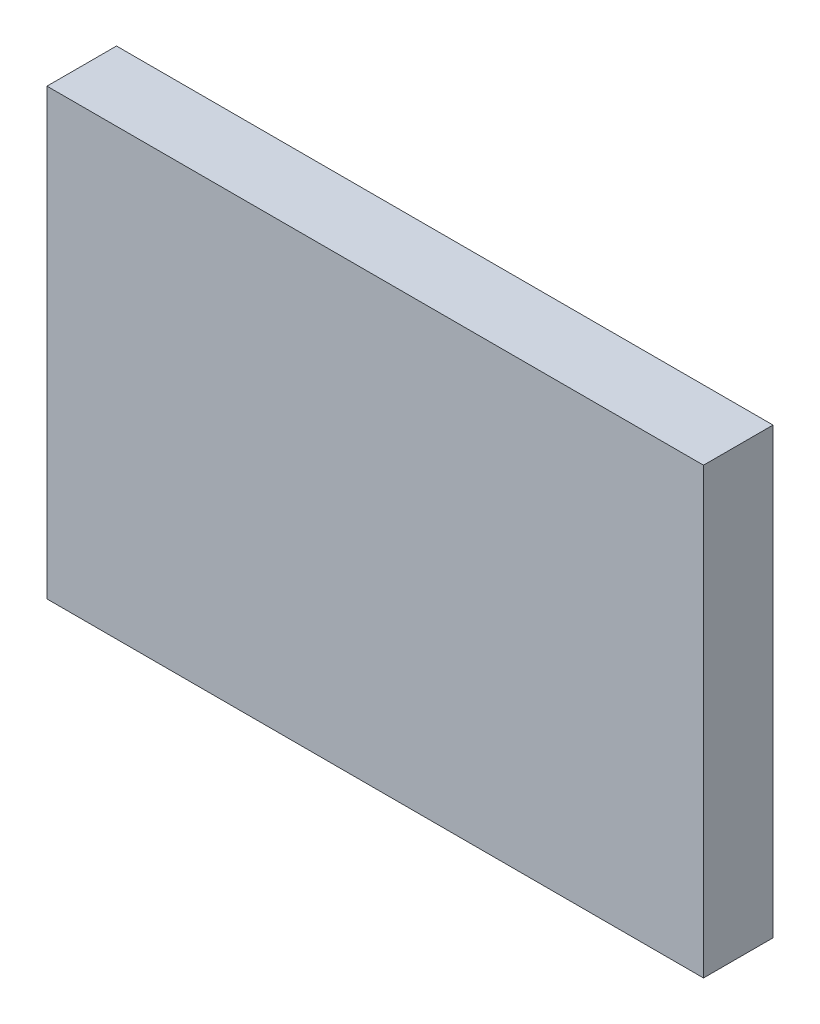
ISO-10303-21;
HEADER;
FILE_DESCRIPTION(('STEP AP214'),'2;1');
FILE_NAME('part.step','',(''),(''),'','','');
FILE_SCHEMA(('AUTOMOTIVE_DESIGN { 1 0 10303 214 1 1 1 1 }'));
ENDSEC;
DATA;
#1=APPLICATION_CONTEXT('core data for automotive mechanical design processes');
#2=APPLICATION_PROTOCOL_DEFINITION('international standard','automotive_design',2000,#1);
#3=PRODUCT_CONTEXT('',#1,'mechanical');
#4=PRODUCT('Part','Part','',(#3));
#5=PRODUCT_RELATED_PRODUCT_CATEGORY('part','',(#4));
#6=PRODUCT_DEFINITION_FORMATION('','',#4);
#7=PRODUCT_DEFINITION_CONTEXT('part definition',#1,'design');
#8=PRODUCT_DEFINITION('design','',#6,#7);
#9=PRODUCT_DEFINITION_SHAPE('','',#8);
#10=(LENGTH_UNIT() NAMED_UNIT(*) SI_UNIT(.MILLI.,.METRE.));
#11=(NAMED_UNIT(*) PLANE_ANGLE_UNIT() SI_UNIT($,.RADIAN.));
#12=(NAMED_UNIT(*) SI_UNIT($,.STERADIAN.) SOLID_ANGLE_UNIT());
#13=UNCERTAINTY_MEASURE_WITH_UNIT(LENGTH_MEASURE(1.E-05),#10,'distance_accuracy_value','');
#14=(GEOMETRIC_REPRESENTATION_CONTEXT(3) GLOBAL_UNCERTAINTY_ASSIGNED_CONTEXT((#13)) GLOBAL_UNIT_ASSIGNED_CONTEXT((#10,
#11,#12)) REPRESENTATION_CONTEXT('',''));
#15=CARTESIAN_POINT('',(0.,0.,0.));
#16=DIRECTION('',(0.,0.,1.));
#17=DIRECTION('',(1.,0.,0.));
#18=AXIS2_PLACEMENT_3D('',#15,#16,#17);
#19=CARTESIAN_POINT('',(85.,-57.5,18.));
#20=DIRECTION('',(-1.,0.,0.));
#21=DIRECTION('',(0.,0.,1.));
#22=AXIS2_PLACEMENT_3D('',#19,#20,#21);
#23=PLANE('',#22);
#24=DIRECTION('',(0.,1.,0.));
#25=VECTOR('',#24,1.);
#26=CARTESIAN_POINT('',(85.,-57.5,0.));
#27=LINE('',#26,#25);
#28=CARTESIAN_POINT('',(85.,-57.5,0.));
#29=VERTEX_POINT('',#28);
#30=CARTESIAN_POINT('',(85.,57.5,0.));
#31=VERTEX_POINT('',#30);
#32=EDGE_CURVE('E97',#29,#31,#27,.T.);
#33=ORIENTED_EDGE('',*,*,#32,.T.);
#34=DIRECTION('',(0.,0.,-1.));
#35=VECTOR('',#34,1.);
#36=CARTESIAN_POINT('',(85.,57.5,18.));
#37=LINE('',#36,#35);
#38=CARTESIAN_POINT('',(85.,57.5,18.));
#39=VERTEX_POINT('',#38);
#40=EDGE_CURVE('E11',#39,#31,#37,.T.);
#41=ORIENTED_EDGE('',*,*,#40,.F.);
#42=DIRECTION('',(0.,1.,0.));
#43=VECTOR('',#42,1.);
#44=CARTESIAN_POINT('',(85.,-57.5,18.));
#45=LINE('',#44,#43);
#46=CARTESIAN_POINT('',(85.,-57.5,18.));
#47=VERTEX_POINT('',#46);
#48=EDGE_CURVE('E85',#47,#39,#45,.T.);
#49=ORIENTED_EDGE('',*,*,#48,.F.);
#50=DIRECTION('',(0.,0.,-1.));
#51=VECTOR('',#50,1.);
#52=CARTESIAN_POINT('',(85.,-57.5,18.));
#53=LINE('',#52,#51);
#54=EDGE_CURVE('E93',#47,#29,#53,.T.);
#55=ORIENTED_EDGE('',*,*,#54,.T.);
#56=EDGE_LOOP('',(#33,#41,#49,#55));
#57=FACE_BOUND('',#56,.T.);
#58=ADVANCED_FACE('F34',(#57),#23,.F.);
#59=CARTESIAN_POINT('',(-85.,57.5,18.));
#60=DIRECTION('',(0.,-1.,0.));
#61=DIRECTION('',(0.,0.,-1.));
#62=AXIS2_PLACEMENT_3D('',#59,#60,#61);
#63=PLANE('',#62);
#64=DIRECTION('',(-1.,0.,0.));
#65=VECTOR('',#64,1.);
#66=CARTESIAN_POINT('',(-85.,57.5,0.));
#67=LINE('',#66,#65);
#68=CARTESIAN_POINT('',(-85.,57.5,0.));
#69=VERTEX_POINT('',#68);
#70=EDGE_CURVE('E89',#31,#69,#67,.T.);
#71=ORIENTED_EDGE('',*,*,#70,.T.);
#72=DIRECTION('',(0.,0.,-1.));
#73=VECTOR('',#72,1.);
#74=CARTESIAN_POINT('',(-85.,57.5,18.));
#75=LINE('',#74,#73);
#76=CARTESIAN_POINT('',(-85.,57.5,18.));
#77=VERTEX_POINT('',#76);
#78=EDGE_CURVE('E42',#77,#69,#75,.T.);
#79=ORIENTED_EDGE('',*,*,#78,.F.);
#80=DIRECTION('',(-1.,0.,0.));
#81=VECTOR('',#80,1.);
#82=CARTESIAN_POINT('',(-85.,57.5,18.));
#83=LINE('',#82,#81);
#84=EDGE_CURVE('E80',#39,#77,#83,.T.);
#85=ORIENTED_EDGE('',*,*,#84,.F.);
#86=ORIENTED_EDGE('',*,*,#40,.T.);
#87=EDGE_LOOP('',(#71,#79,#85,#86));
#88=FACE_BOUND('',#87,.T.);
#89=ADVANCED_FACE('F88',(#88),#63,.F.);
#90=CARTESIAN_POINT('',(-85.,-57.5,18.));
#91=DIRECTION('',(1.,0.,0.));
#92=DIRECTION('',(0.,0.,-1.));
#93=AXIS2_PLACEMENT_3D('',#90,#91,#92);
#94=PLANE('',#93);
#95=DIRECTION('',(0.,-1.,0.));
#96=VECTOR('',#95,1.);
#97=CARTESIAN_POINT('',(-85.,-57.5,0.));
#98=LINE('',#97,#96);
#99=CARTESIAN_POINT('',(-85.,-57.5,0.));
#100=VERTEX_POINT('',#99);
#101=EDGE_CURVE('E67',#69,#100,#98,.T.);
#102=ORIENTED_EDGE('',*,*,#101,.T.);
#103=DIRECTION('',(0.,0.,-1.));
#104=VECTOR('',#103,1.);
#105=CARTESIAN_POINT('',(-85.,-57.5,18.));
#106=LINE('',#105,#104);
#107=CARTESIAN_POINT('',(-85.,-57.5,18.));
#108=VERTEX_POINT('',#107);
#109=EDGE_CURVE('E90',#108,#100,#106,.T.);
#110=ORIENTED_EDGE('',*,*,#109,.F.);
#111=DIRECTION('',(0.,-1.,0.));
#112=VECTOR('',#111,1.);
#113=CARTESIAN_POINT('',(-85.,-57.5,18.));
#114=LINE('',#113,#112);
#115=EDGE_CURVE('E83',#77,#108,#114,.T.);
#116=ORIENTED_EDGE('',*,*,#115,.F.);
#117=ORIENTED_EDGE('',*,*,#78,.T.);
#118=EDGE_LOOP('',(#102,#110,#116,#117));
#119=FACE_BOUND('',#118,.T.);
#120=ADVANCED_FACE('F91',(#119),#94,.F.);
#121=CARTESIAN_POINT('',(-85.,-57.5,18.));
#122=DIRECTION('',(0.,1.,0.));
#123=DIRECTION('',(0.,0.,1.));
#124=AXIS2_PLACEMENT_3D('',#121,#122,#123);
#125=PLANE('',#124);
#126=DIRECTION('',(1.,0.,0.));
#127=VECTOR('',#126,1.);
#128=CARTESIAN_POINT('',(-85.,-57.5,0.));
#129=LINE('',#128,#127);
#130=EDGE_CURVE('E73',#100,#29,#129,.T.);
#131=ORIENTED_EDGE('',*,*,#130,.T.);
#132=ORIENTED_EDGE('',*,*,#54,.F.);
#133=DIRECTION('',(1.,0.,0.));
#134=VECTOR('',#133,1.);
#135=CARTESIAN_POINT('',(-85.,-57.5,18.));
#136=LINE('',#135,#134);
#137=EDGE_CURVE('E50',#108,#47,#136,.T.);
#138=ORIENTED_EDGE('',*,*,#137,.F.);
#139=ORIENTED_EDGE('',*,*,#109,.T.);
#140=EDGE_LOOP('',(#131,#132,#138,#139));
#141=FACE_BOUND('',#140,.T.);
#142=ADVANCED_FACE('F104',(#141),#125,.F.);
#143=CARTESIAN_POINT('',(0.,0.,18.));
#144=DIRECTION('',(0.,0.,-1.));
#145=DIRECTION('',(-1.,0.,0.));
#146=AXIS2_PLACEMENT_3D('',#143,#144,#145);
#147=PLANE('',#146);
#148=ORIENTED_EDGE('',*,*,#48,.T.);
#149=ORIENTED_EDGE('',*,*,#84,.T.);
#150=ORIENTED_EDGE('',*,*,#115,.T.);
#151=ORIENTED_EDGE('',*,*,#137,.T.);
#152=EDGE_LOOP('',(#148,#149,#150,#151));
#153=FACE_BOUND('',#152,.T.);
#154=ADVANCED_FACE('F81',(#153),#147,.F.);
#155=CARTESIAN_POINT('',(0.,0.,0.));
#156=DIRECTION('',(0.,0.,-1.));
#157=DIRECTION('',(-1.,0.,0.));
#158=AXIS2_PLACEMENT_3D('',#155,#156,#157);
#159=PLANE('',#158);
#160=ORIENTED_EDGE('',*,*,#32,.F.);
#161=ORIENTED_EDGE('',*,*,#130,.F.);
#162=ORIENTED_EDGE('',*,*,#101,.F.);
#163=ORIENTED_EDGE('',*,*,#70,.F.);
#164=EDGE_LOOP('',(#160,#161,#162,#163));
#165=FACE_BOUND('',#164,.T.);
#166=ADVANCED_FACE('F107',(#165),#159,.T.);
#167=CLOSED_SHELL('',(#58,#89,#120,#142,#154,#166));
#168=MANIFOLD_SOLID_BREP('B2',#167);
#169=ADVANCED_BREP_SHAPE_REPRESENTATION('',(#18,#168),#14);
#170=SHAPE_DEFINITION_REPRESENTATION(#9,#169);
ENDSEC;
END-ISO-10303-21;
